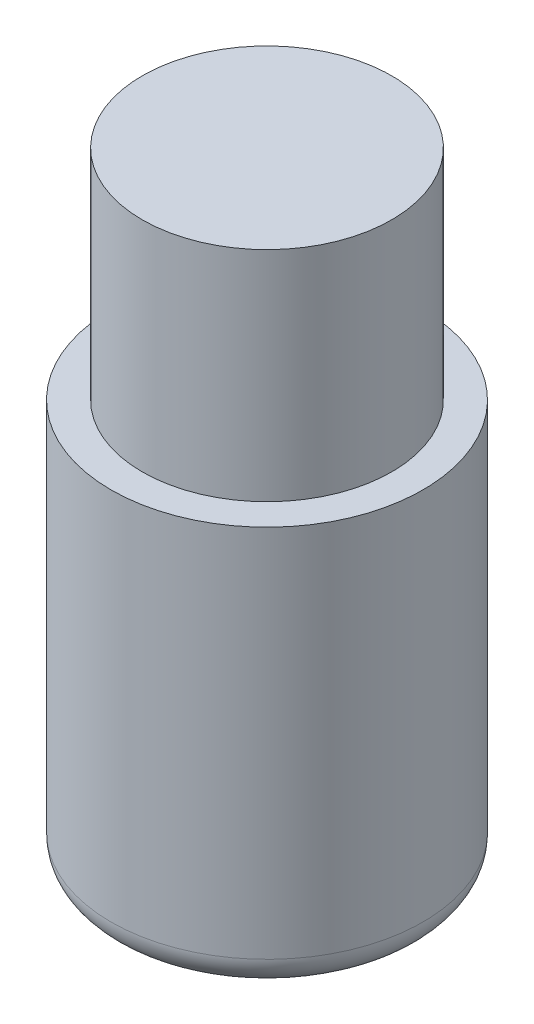
ISO-10303-21;
HEADER;
FILE_DESCRIPTION(('STEP AP214'),'2;1');
FILE_NAME('part.step','',(''),(''),'','','');
FILE_SCHEMA(('AUTOMOTIVE_DESIGN { 1 0 10303 214 1 1 1 1 }'));
ENDSEC;
DATA;
#1=APPLICATION_CONTEXT('core data for automotive mechanical design processes');
#2=APPLICATION_PROTOCOL_DEFINITION('international standard','automotive_design',2000,#1);
#3=PRODUCT_CONTEXT('',#1,'mechanical');
#4=PRODUCT('Part','Part','',(#3));
#5=PRODUCT_RELATED_PRODUCT_CATEGORY('part','',(#4));
#6=PRODUCT_DEFINITION_FORMATION('','',#4);
#7=PRODUCT_DEFINITION_CONTEXT('part definition',#1,'design');
#8=PRODUCT_DEFINITION('design','',#6,#7);
#9=PRODUCT_DEFINITION_SHAPE('','',#8);
#10=(LENGTH_UNIT() NAMED_UNIT(*) SI_UNIT(.MILLI.,.METRE.));
#11=(NAMED_UNIT(*) PLANE_ANGLE_UNIT() SI_UNIT($,.RADIAN.));
#12=(NAMED_UNIT(*) SI_UNIT($,.STERADIAN.) SOLID_ANGLE_UNIT());
#13=UNCERTAINTY_MEASURE_WITH_UNIT(LENGTH_MEASURE(1.E-05),#10,'distance_accuracy_value','');
#14=(GEOMETRIC_REPRESENTATION_CONTEXT(3) GLOBAL_UNCERTAINTY_ASSIGNED_CONTEXT((#13)) GLOBAL_UNIT_ASSIGNED_CONTEXT((#10,
#11,#12)) REPRESENTATION_CONTEXT('',''));
#15=CARTESIAN_POINT('',(0.,0.,0.));
#16=DIRECTION('',(0.,0.,1.));
#17=DIRECTION('',(1.,0.,0.));
#18=AXIS2_PLACEMENT_3D('',#15,#16,#17);
#19=CARTESIAN_POINT('',(0.,13.,0.));
#20=DIRECTION('',(0.,-1.,0.));
#21=DIRECTION('',(0.,0.,-1.));
#22=AXIS2_PLACEMENT_3D('',#19,#20,#21);
#23=CYLINDRICAL_SURFACE('',#22,5.);
#24=CARTESIAN_POINT('',(0.,1.,0.));
#25=DIRECTION('',(0.,1.,0.));
#26=DIRECTION('',(0.,0.,1.));
#27=AXIS2_PLACEMENT_3D('',#24,#25,#26);
#28=CIRCLE('',#27,5.);
#29=CARTESIAN_POINT('',(0.,0.999999999999999,-5.));
#30=VERTEX_POINT('',#29);
#31=EDGE_CURVE('E43',#30,#30,#28,.T.);
#32=CARTESIAN_POINT('',(0.,13.,0.));
#33=DIRECTION('',(0.,1.,0.));
#34=DIRECTION('',(0.,0.,1.));
#35=AXIS2_PLACEMENT_3D('',#32,#33,#34);
#36=CIRCLE('',#35,5.);
#37=CARTESIAN_POINT('',(0.,13.,-5.));
#38=VERTEX_POINT('',#37);
#39=EDGE_CURVE('E47',#38,#38,#36,.T.);
#40=CARTESIAN_POINT('',(0.,0.999999999999999,-5.));
#41=CARTESIAN_POINT('',(0.,1.125,-5.));
#42=CARTESIAN_POINT('',(0.,1.25,-5.));
#43=CARTESIAN_POINT('',(0.,1.5,-5.));
#44=CARTESIAN_POINT('',(0.,1.625,-5.));
#45=CARTESIAN_POINT('',(0.,1.875,-5.));
#46=CARTESIAN_POINT('',(0.,2.,-5.));
#47=CARTESIAN_POINT('',(0.,2.25,-5.));
#48=CARTESIAN_POINT('',(0.,2.375,-5.));
#49=CARTESIAN_POINT('',(0.,2.625,-5.));
#50=CARTESIAN_POINT('',(0.,2.75,-5.));
#51=CARTESIAN_POINT('',(0.,3.,-5.));
#52=CARTESIAN_POINT('',(0.,3.125,-5.));
#53=CARTESIAN_POINT('',(0.,3.375,-5.));
#54=CARTESIAN_POINT('',(0.,3.5,-5.));
#55=CARTESIAN_POINT('',(0.,3.75,-5.));
#56=CARTESIAN_POINT('',(0.,3.875,-5.));
#57=CARTESIAN_POINT('',(0.,4.125,-5.));
#58=CARTESIAN_POINT('',(0.,4.25,-5.));
#59=CARTESIAN_POINT('',(0.,4.5,-5.));
#60=CARTESIAN_POINT('',(0.,4.625,-5.));
#61=CARTESIAN_POINT('',(0.,4.875,-5.));
#62=CARTESIAN_POINT('',(0.,5.,-5.));
#63=CARTESIAN_POINT('',(0.,5.25,-5.));
#64=CARTESIAN_POINT('',(0.,5.375,-5.));
#65=CARTESIAN_POINT('',(0.,5.625,-5.));
#66=CARTESIAN_POINT('',(0.,5.75,-5.));
#67=CARTESIAN_POINT('',(0.,6.,-5.));
#68=CARTESIAN_POINT('',(0.,6.125,-5.));
#69=CARTESIAN_POINT('',(0.,6.375,-5.));
#70=CARTESIAN_POINT('',(0.,6.5,-5.));
#71=CARTESIAN_POINT('',(0.,6.75,-5.));
#72=CARTESIAN_POINT('',(0.,6.875,-5.));
#73=CARTESIAN_POINT('',(0.,7.125,-5.));
#74=CARTESIAN_POINT('',(0.,7.25,-5.));
#75=CARTESIAN_POINT('',(0.,7.5,-5.));
#76=CARTESIAN_POINT('',(0.,7.625,-5.));
#77=CARTESIAN_POINT('',(0.,7.875,-5.));
#78=CARTESIAN_POINT('',(0.,8.,-5.));
#79=CARTESIAN_POINT('',(0.,8.25,-5.));
#80=CARTESIAN_POINT('',(0.,8.375,-5.));
#81=CARTESIAN_POINT('',(0.,8.625,-5.));
#82=CARTESIAN_POINT('',(0.,8.75,-5.));
#83=CARTESIAN_POINT('',(0.,9.,-5.));
#84=CARTESIAN_POINT('',(0.,9.125,-5.));
#85=CARTESIAN_POINT('',(0.,9.375,-5.));
#86=CARTESIAN_POINT('',(0.,9.5,-5.));
#87=CARTESIAN_POINT('',(0.,9.75,-5.));
#88=CARTESIAN_POINT('',(0.,9.875,-5.));
#89=CARTESIAN_POINT('',(0.,10.125,-5.));
#90=CARTESIAN_POINT('',(0.,10.25,-5.));
#91=CARTESIAN_POINT('',(0.,10.5,-5.));
#92=CARTESIAN_POINT('',(0.,10.625,-5.));
#93=CARTESIAN_POINT('',(0.,10.875,-5.));
#94=CARTESIAN_POINT('',(0.,11.,-5.));
#95=CARTESIAN_POINT('',(0.,11.25,-5.));
#96=CARTESIAN_POINT('',(0.,11.375,-5.));
#97=CARTESIAN_POINT('',(0.,11.625,-5.));
#98=CARTESIAN_POINT('',(0.,11.75,-5.));
#99=CARTESIAN_POINT('',(0.,12.,-5.));
#100=CARTESIAN_POINT('',(0.,12.125,-5.));
#101=CARTESIAN_POINT('',(0.,12.375,-5.));
#102=CARTESIAN_POINT('',(0.,12.5,-5.));
#103=CARTESIAN_POINT('',(0.,12.75,-5.));
#104=CARTESIAN_POINT('',(0.,12.875,-5.));
#105=CARTESIAN_POINT('',(0.,13.,-5.));
#106=B_SPLINE_CURVE_WITH_KNOTS('',3,(#40,#41,#42,#43,#44,#45,#46,#47,#48,#49,#50,#51,#52,#53,
#54,#55,#56,#57,#58,#59,#60,#61,#62,#63,#64,#65,#66,#67,#68,#69,#70,#71,#72,#73,#74,#75,#76,#77,
#78,#79,#80,#81,#82,#83,#84,#85,#86,#87,#88,#89,#90,#91,#92,#93,#94,#95,#96,#97,#98,#99,#100,
#101,#102,#103,#104,#105),.UNSPECIFIED.,.F.,.F.,(4,2,2,2,2,2,2,2,2,2,2,2,2,2,2,2,2,2,2,2,2,2,2,
2,2,2,2,2,2,2,2,2,4),(0.,0.375,0.750000000000001,1.125,1.5,1.875,2.25,2.625,3.,3.375,3.75,4.125,
4.5,4.875,5.25,5.625,6.,6.375,6.75,7.125,7.5,7.875,8.25,8.625,9.,9.375,9.75,10.125,10.5,10.875,
11.25,11.625,12.),.UNSPECIFIED.);
#107=EDGE_CURVE('BSEAM31',#30,#38,#106,.T.);
#108=ORIENTED_EDGE('',*,*,#31,.T.);
#109=ORIENTED_EDGE('',*,*,#39,.F.);
#110=ORIENTED_EDGE('',*,*,#107,.T.);
#111=ORIENTED_EDGE('',*,*,#107,.F.);
#112=EDGE_LOOP('',(#108,#110,#109,#111));
#113=FACE_BOUND('',#112,.T.);
#114=ADVANCED_FACE('F31',(#113),#23,.T.);
#115=CARTESIAN_POINT('',(0.,13.,0.));
#116=DIRECTION('',(0.,1.,0.));
#117=DIRECTION('',(0.,0.,1.));
#118=AXIS2_PLACEMENT_3D('',#115,#116,#117);
#119=PLANE('',#118);
#120=CARTESIAN_POINT('',(0.,13.,0.));
#121=DIRECTION('',(0.,1.,0.));
#122=DIRECTION('',(0.,0.,1.));
#123=AXIS2_PLACEMENT_3D('',#120,#121,#122);
#124=CIRCLE('',#123,4.);
#125=CARTESIAN_POINT('',(0.,13.,4.));
#126=VERTEX_POINT('',#125);
#127=EDGE_CURVE('E10',#126,#126,#124,.T.);
#128=ORIENTED_EDGE('',*,*,#127,.F.);
#129=EDGE_LOOP('',(#128));
#130=FACE_BOUND('',#129,.T.);
#131=ORIENTED_EDGE('',*,*,#39,.T.);
#132=EDGE_LOOP('',(#131));
#133=FACE_BOUND('',#132,.T.);
#134=ADVANCED_FACE('F65',(#130,#133),#119,.T.);
#135=CARTESIAN_POINT('',(0.,0.,0.));
#136=DIRECTION('',(0.,1.,0.));
#137=DIRECTION('',(0.,0.,1.));
#138=AXIS2_PLACEMENT_3D('',#135,#136,#137);
#139=PLANE('',#138);
#140=CARTESIAN_POINT('',(0.,0.,0.));
#141=DIRECTION('',(0.,1.,0.));
#142=DIRECTION('',(0.,0.,1.));
#143=AXIS2_PLACEMENT_3D('',#140,#141,#142);
#144=CIRCLE('',#143,4.);
#145=CARTESIAN_POINT('',(0.,0.,4.));
#146=VERTEX_POINT('',#145);
#147=EDGE_CURVE('E35',#146,#146,#144,.F.);
#148=ORIENTED_EDGE('',*,*,#147,.T.);
#149=EDGE_LOOP('',(#148));
#150=FACE_BOUND('',#149,.T.);
#151=ADVANCED_FACE('F56',(#150),#139,.F.);
#152=CARTESIAN_POINT('',(0.,1.,0.));
#153=DIRECTION('',(0.,1.,0.));
#154=DIRECTION('',(0.,0.,1.));
#155=AXIS2_PLACEMENT_3D('',#152,#153,#154);
#156=TOROIDAL_SURFACE('',#155,4.,1.);
#157=ORIENTED_EDGE('',*,*,#147,.F.);
#158=EDGE_LOOP('',(#157));
#159=FACE_BOUND('',#158,.T.);
#160=ORIENTED_EDGE('',*,*,#31,.F.);
#161=EDGE_LOOP('',(#160));
#162=FACE_BOUND('',#161,.T.);
#163=ADVANCED_FACE('F33',(#159,#162),#156,.T.);
#164=CARTESIAN_POINT('',(0.,20.,0.));
#165=DIRECTION('',(0.,-1.,0.));
#166=DIRECTION('',(0.,0.,-1.));
#167=AXIS2_PLACEMENT_3D('',#164,#165,#166);
#168=CYLINDRICAL_SURFACE('',#167,4.);
#169=CARTESIAN_POINT('',(0.,20.,0.));
#170=DIRECTION('',(0.,1.,0.));
#171=DIRECTION('',(0.,0.,1.));
#172=AXIS2_PLACEMENT_3D('',#169,#170,#171);
#173=CIRCLE('',#172,4.);
#174=CARTESIAN_POINT('',(0.,20.,4.));
#175=VERTEX_POINT('',#174);
#176=EDGE_CURVE('E46',#175,#175,#173,.T.);
#177=ORIENTED_EDGE('',*,*,#176,.F.);
#178=EDGE_LOOP('',(#177));
#179=FACE_BOUND('',#178,.T.);
#180=ORIENTED_EDGE('',*,*,#127,.T.);
#181=EDGE_LOOP('',(#180));
#182=FACE_BOUND('',#181,.T.);
#183=ADVANCED_FACE('F55',(#179,#182),#168,.T.);
#184=CARTESIAN_POINT('',(0.,20.,0.));
#185=DIRECTION('',(0.,1.,0.));
#186=DIRECTION('',(0.,0.,1.));
#187=AXIS2_PLACEMENT_3D('',#184,#185,#186);
#188=PLANE('',#187);
#189=ORIENTED_EDGE('',*,*,#176,.T.);
#190=EDGE_LOOP('',(#189));
#191=FACE_BOUND('',#190,.T.);
#192=ADVANCED_FACE('F62',(#191),#188,.T.);
#193=CLOSED_SHELL('',(#114,#134,#151,#163,#183,#192));
#194=MANIFOLD_SOLID_BREP('B2',#193);
#195=ADVANCED_BREP_SHAPE_REPRESENTATION('',(#18,#194),#14);
#196=SHAPE_DEFINITION_REPRESENTATION(#9,#195);
ENDSEC;
END-ISO-10303-21;
